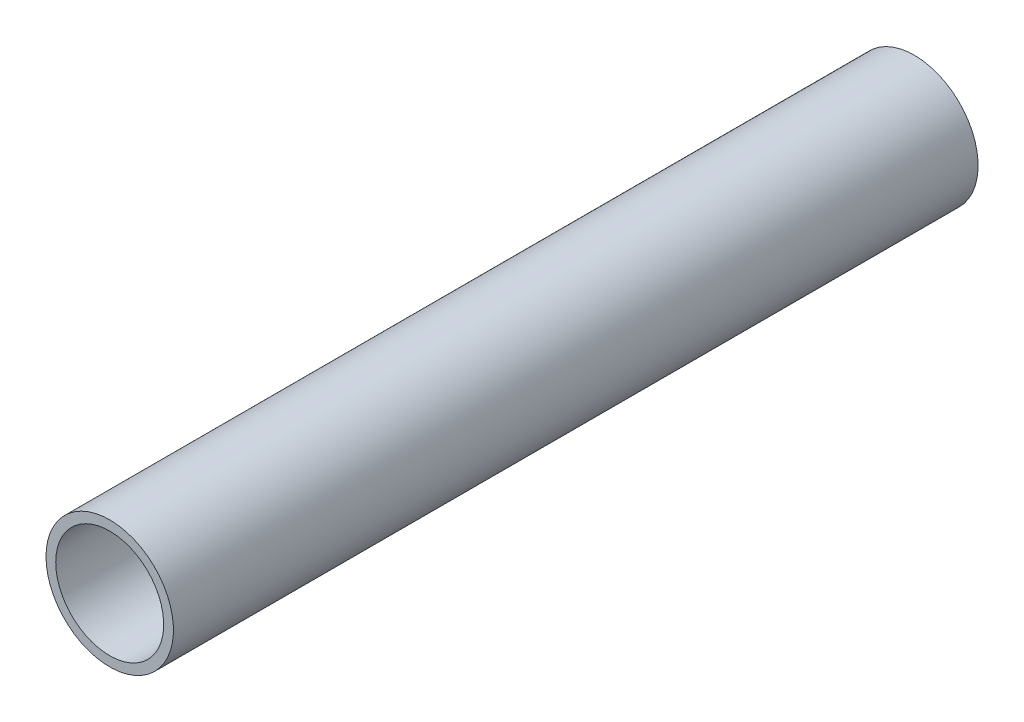
ISO-10303-21;
HEADER;
FILE_DESCRIPTION(('STEP AP214'),'2;1');
FILE_NAME('part.step','',(''),(''),'','','');
FILE_SCHEMA(('AUTOMOTIVE_DESIGN { 1 0 10303 214 1 1 1 1 }'));
ENDSEC;
DATA;
#1=APPLICATION_CONTEXT('core data for automotive mechanical design processes');
#2=APPLICATION_PROTOCOL_DEFINITION('international standard','automotive_design',2000,#1);
#3=PRODUCT_CONTEXT('',#1,'mechanical');
#4=PRODUCT('Part','Part','',(#3));
#5=PRODUCT_RELATED_PRODUCT_CATEGORY('part','',(#4));
#6=PRODUCT_DEFINITION_FORMATION('','',#4);
#7=PRODUCT_DEFINITION_CONTEXT('part definition',#1,'design');
#8=PRODUCT_DEFINITION('design','',#6,#7);
#9=PRODUCT_DEFINITION_SHAPE('','',#8);
#10=(LENGTH_UNIT() NAMED_UNIT(*) SI_UNIT(.MILLI.,.METRE.));
#11=(NAMED_UNIT(*) PLANE_ANGLE_UNIT() SI_UNIT($,.RADIAN.));
#12=(NAMED_UNIT(*) SI_UNIT($,.STERADIAN.) SOLID_ANGLE_UNIT());
#13=UNCERTAINTY_MEASURE_WITH_UNIT(LENGTH_MEASURE(1.E-05),#10,'distance_accuracy_value','');
#14=(GEOMETRIC_REPRESENTATION_CONTEXT(3) GLOBAL_UNCERTAINTY_ASSIGNED_CONTEXT((#13)) GLOBAL_UNIT_ASSIGNED_CONTEXT((#10,
#11,#12)) REPRESENTATION_CONTEXT('',''));
#15=CARTESIAN_POINT('',(0.,0.,0.));
#16=DIRECTION('',(0.,0.,1.));
#17=DIRECTION('',(1.,0.,0.));
#18=AXIS2_PLACEMENT_3D('',#15,#16,#17);
#19=CARTESIAN_POINT('',(0.,0.,304.8));
#20=DIRECTION('',(0.,0.,-1.));
#21=DIRECTION('',(-1.,0.,0.));
#22=AXIS2_PLACEMENT_3D('',#19,#20,#21);
#23=CYLINDRICAL_SURFACE('',#22,20.447);
#24=CARTESIAN_POINT('',(0.,0.,304.8));
#25=DIRECTION('',(0.,0.,1.));
#26=DIRECTION('',(1.,0.,0.));
#27=AXIS2_PLACEMENT_3D('',#24,#25,#26);
#28=CIRCLE('',#27,20.447);
#29=CARTESIAN_POINT('',(-20.447,0.,304.8));
#30=VERTEX_POINT('',#29);
#31=EDGE_CURVE('E56',#30,#30,#28,.T.);
#32=CARTESIAN_POINT('',(0.,0.,8.0772));
#33=DIRECTION('',(0.,0.,-1.));
#34=DIRECTION('',(-1.,0.,0.));
#35=AXIS2_PLACEMENT_3D('',#32,#33,#34);
#36=CIRCLE('',#35,20.447);
#37=CARTESIAN_POINT('',(-20.447,0.,8.07720000000001));
#38=VERTEX_POINT('',#37);
#39=EDGE_CURVE('E70',#38,#38,#36,.T.);
#40=CARTESIAN_POINT('',(-20.447,0.,304.8));
#41=CARTESIAN_POINT('',(-20.447,0.,301.7091375));
#42=CARTESIAN_POINT('',(-20.447,0.,298.618275));
#43=CARTESIAN_POINT('',(-20.447,0.,292.43655));
#44=CARTESIAN_POINT('',(-20.447,0.,289.3456875));
#45=CARTESIAN_POINT('',(-20.447,0.,283.1639625));
#46=CARTESIAN_POINT('',(-20.447,0.,280.0731));
#47=CARTESIAN_POINT('',(-20.447,0.,273.891375));
#48=CARTESIAN_POINT('',(-20.447,0.,270.8005125));
#49=CARTESIAN_POINT('',(-20.447,0.,264.6187875));
#50=CARTESIAN_POINT('',(-20.447,0.,261.527925));
#51=CARTESIAN_POINT('',(-20.447,0.,255.3462));
#52=CARTESIAN_POINT('',(-20.447,0.,252.2553375));
#53=CARTESIAN_POINT('',(-20.447,0.,246.0736125));
#54=CARTESIAN_POINT('',(-20.447,0.,242.98275));
#55=CARTESIAN_POINT('',(-20.447,0.,236.801025));
#56=CARTESIAN_POINT('',(-20.447,0.,233.7101625));
#57=CARTESIAN_POINT('',(-20.447,0.,227.5284375));
#58=CARTESIAN_POINT('',(-20.447,0.,224.437575));
#59=CARTESIAN_POINT('',(-20.447,0.,218.25585));
#60=CARTESIAN_POINT('',(-20.447,0.,215.1649875));
#61=CARTESIAN_POINT('',(-20.447,0.,208.9832625));
#62=CARTESIAN_POINT('',(-20.447,0.,205.8924));
#63=CARTESIAN_POINT('',(-20.447,0.,199.710675));
#64=CARTESIAN_POINT('',(-20.447,0.,196.6198125));
#65=CARTESIAN_POINT('',(-20.447,0.,190.4380875));
#66=CARTESIAN_POINT('',(-20.447,0.,187.347225));
#67=CARTESIAN_POINT('',(-20.447,0.,181.1655));
#68=CARTESIAN_POINT('',(-20.447,0.,178.0746375));
#69=CARTESIAN_POINT('',(-20.447,0.,171.8929125));
#70=CARTESIAN_POINT('',(-20.447,0.,168.80205));
#71=CARTESIAN_POINT('',(-20.447,0.,162.620325));
#72=CARTESIAN_POINT('',(-20.447,0.,159.5294625));
#73=CARTESIAN_POINT('',(-20.447,0.,153.3477375));
#74=CARTESIAN_POINT('',(-20.447,0.,150.256875));
#75=CARTESIAN_POINT('',(-20.447,0.,144.07515));
#76=CARTESIAN_POINT('',(-20.447,0.,140.9842875));
#77=CARTESIAN_POINT('',(-20.447,0.,134.8025625));
#78=CARTESIAN_POINT('',(-20.447,0.,131.7117));
#79=CARTESIAN_POINT('',(-20.447,0.,125.529975));
#80=CARTESIAN_POINT('',(-20.447,0.,122.4391125));
#81=CARTESIAN_POINT('',(-20.447,0.,116.2573875));
#82=CARTESIAN_POINT('',(-20.447,0.,113.166525));
#83=CARTESIAN_POINT('',(-20.447,0.,106.9848));
#84=CARTESIAN_POINT('',(-20.447,0.,103.8939375));
#85=CARTESIAN_POINT('',(-20.447,0.,97.7122125));
#86=CARTESIAN_POINT('',(-20.447,0.,94.62135));
#87=CARTESIAN_POINT('',(-20.447,0.,88.439625));
#88=CARTESIAN_POINT('',(-20.447,0.,85.3487625));
#89=CARTESIAN_POINT('',(-20.447,0.,79.1670375));
#90=CARTESIAN_POINT('',(-20.447,0.,76.0761749999999));
#91=CARTESIAN_POINT('',(-20.447,0.,69.8944499999999));
#92=CARTESIAN_POINT('',(-20.447,0.,66.8035875));
#93=CARTESIAN_POINT('',(-20.447,0.,60.6218625));
#94=CARTESIAN_POINT('',(-20.447,0.,57.531));
#95=CARTESIAN_POINT('',(-20.447,0.,51.349275));
#96=CARTESIAN_POINT('',(-20.447,0.,48.2584125));
#97=CARTESIAN_POINT('',(-20.447,0.,42.0766875));
#98=CARTESIAN_POINT('',(-20.447,0.,38.985825));
#99=CARTESIAN_POINT('',(-20.447,0.,32.8041));
#100=CARTESIAN_POINT('',(-20.447,0.,29.7132375));
#101=CARTESIAN_POINT('',(-20.447,0.,23.5315125));
#102=CARTESIAN_POINT('',(-20.447,0.,20.44065));
#103=CARTESIAN_POINT('',(-20.447,0.,14.258925));
#104=CARTESIAN_POINT('',(-20.447,0.,11.1680625));
#105=CARTESIAN_POINT('',(-20.447,0.,8.07720000000001));
#106=B_SPLINE_CURVE_WITH_KNOTS('',3,(#40,#41,#42,#43,#44,#45,#46,#47,#48,#49,#50,#51,#52,#53,
#54,#55,#56,#57,#58,#59,#60,#61,#62,#63,#64,#65,#66,#67,#68,#69,#70,#71,#72,#73,#74,#75,#76,#77,
#78,#79,#80,#81,#82,#83,#84,#85,#86,#87,#88,#89,#90,#91,#92,#93,#94,#95,#96,#97,#98,#99,#100,
#101,#102,#103,#104,#105),.UNSPECIFIED.,.F.,.F.,(4,2,2,2,2,2,2,2,2,2,2,2,2,2,2,2,2,2,2,2,2,2,2,
2,2,2,2,2,2,2,2,2,4),(0.,9.27258750000004,18.545175,27.8177625,37.0903500000001,46.3629375,
55.635525,64.9081125,74.1807,83.4532875,92.725875,101.9984625,111.27105,120.5436375,129.816225,
139.0888125,148.3614,157.6339875,166.906575,176.1791625,185.45175,194.7243375,203.996925,
213.2695125,222.5421,231.8146875,241.087275,250.3598625,259.63245,268.9050375,278.177625,
287.4502125,296.7228),.UNSPECIFIED.);
#107=EDGE_CURVE('BSEAM43',#30,#38,#106,.T.);
#108=ORIENTED_EDGE('',*,*,#31,.T.);
#109=ORIENTED_EDGE('',*,*,#39,.T.);
#110=ORIENTED_EDGE('',*,*,#107,.T.);
#111=ORIENTED_EDGE('',*,*,#107,.F.);
#112=EDGE_LOOP('',(#108,#110,#109,#111));
#113=FACE_BOUND('',#112,.T.);
#114=ADVANCED_FACE('F43',(#113),#23,.F.);
#115=CARTESIAN_POINT('',(0.,0.,304.8));
#116=DIRECTION('',(0.,0.,1.));
#117=DIRECTION('',(1.,0.,0.));
#118=AXIS2_PLACEMENT_3D('',#115,#116,#117);
#119=PLANE('',#118);
#120=CARTESIAN_POINT('',(0.,0.,304.8));
#121=DIRECTION('',(0.,0.,1.));
#122=DIRECTION('',(1.,0.,0.));
#123=AXIS2_PLACEMENT_3D('',#120,#121,#122);
#124=CIRCLE('',#123,24.13);
#125=CARTESIAN_POINT('',(-24.13,0.,304.8));
#126=VERTEX_POINT('',#125);
#127=EDGE_CURVE('E10',#126,#126,#124,.T.);
#128=ORIENTED_EDGE('',*,*,#127,.T.);
#129=EDGE_LOOP('',(#128));
#130=FACE_BOUND('',#129,.T.);
#131=ORIENTED_EDGE('',*,*,#31,.F.);
#132=EDGE_LOOP('',(#131));
#133=FACE_BOUND('',#132,.T.);
#134=ADVANCED_FACE('F103',(#130,#133),#119,.T.);
#135=CARTESIAN_POINT('',(0.,0.,0.));
#136=DIRECTION('',(0.,0.,1.));
#137=DIRECTION('',(1.,0.,0.));
#138=AXIS2_PLACEMENT_3D('',#135,#136,#137);
#139=PLANE('',#138);
#140=CARTESIAN_POINT('',(0.,0.,0.));
#141=DIRECTION('',(0.,0.,1.));
#142=DIRECTION('',(1.,0.,0.));
#143=AXIS2_PLACEMENT_3D('',#140,#141,#142);
#144=CIRCLE('',#143,24.13);
#145=CARTESIAN_POINT('',(-24.13,0.,0.));
#146=VERTEX_POINT('',#145);
#147=EDGE_CURVE('E47',#146,#146,#144,.T.);
#148=ORIENTED_EDGE('',*,*,#147,.F.);
#149=EDGE_LOOP('',(#148));
#150=FACE_BOUND('',#149,.T.);
#151=CARTESIAN_POINT('',(0.,0.,0.));
#152=DIRECTION('',(0.,0.,1.));
#153=DIRECTION('',(1.,0.,0.));
#154=AXIS2_PLACEMENT_3D('',#151,#152,#153);
#155=CIRCLE('',#154,20.447);
#156=CARTESIAN_POINT('',(-20.447,0.,0.));
#157=VERTEX_POINT('',#156);
#158=EDGE_CURVE('E58',#157,#157,#155,.T.);
#159=ORIENTED_EDGE('',*,*,#158,.T.);
#160=EDGE_LOOP('',(#159));
#161=FACE_BOUND('',#160,.T.);
#162=ADVANCED_FACE('F111',(#150,#161),#139,.F.);
#163=CARTESIAN_POINT('',(0.,0.,304.8));
#164=DIRECTION('',(0.,0.,-1.));
#165=DIRECTION('',(-1.,0.,0.));
#166=AXIS2_PLACEMENT_3D('',#163,#164,#165);
#167=CYLINDRICAL_SURFACE('',#166,24.13);
#168=CARTESIAN_POINT('',(-24.13,0.,304.8));
#169=CARTESIAN_POINT('',(-24.13,0.,301.625));
#170=CARTESIAN_POINT('',(-24.13,0.,298.45));
#171=CARTESIAN_POINT('',(-24.13,0.,292.1));
#172=CARTESIAN_POINT('',(-24.13,0.,288.925));
#173=CARTESIAN_POINT('',(-24.13,0.,282.575));
#174=CARTESIAN_POINT('',(-24.13,0.,279.4));
#175=CARTESIAN_POINT('',(-24.13,0.,273.05));
#176=CARTESIAN_POINT('',(-24.13,0.,269.875));
#177=CARTESIAN_POINT('',(-24.13,0.,263.525));
#178=CARTESIAN_POINT('',(-24.13,0.,260.35));
#179=CARTESIAN_POINT('',(-24.13,0.,254.));
#180=CARTESIAN_POINT('',(-24.13,0.,250.825));
#181=CARTESIAN_POINT('',(-24.13,0.,244.475));
#182=CARTESIAN_POINT('',(-24.13,0.,241.3));
#183=CARTESIAN_POINT('',(-24.13,0.,234.95));
#184=CARTESIAN_POINT('',(-24.13,0.,231.775));
#185=CARTESIAN_POINT('',(-24.13,0.,225.425));
#186=CARTESIAN_POINT('',(-24.13,0.,222.25));
#187=CARTESIAN_POINT('',(-24.13,0.,215.9));
#188=CARTESIAN_POINT('',(-24.13,0.,212.725));
#189=CARTESIAN_POINT('',(-24.13,0.,206.375));
#190=CARTESIAN_POINT('',(-24.13,0.,203.2));
#191=CARTESIAN_POINT('',(-24.13,0.,196.85));
#192=CARTESIAN_POINT('',(-24.13,0.,193.675));
#193=CARTESIAN_POINT('',(-24.13,0.,187.325));
#194=CARTESIAN_POINT('',(-24.13,0.,184.15));
#195=CARTESIAN_POINT('',(-24.13,0.,177.8));
#196=CARTESIAN_POINT('',(-24.13,0.,174.625));
#197=CARTESIAN_POINT('',(-24.13,0.,168.275));
#198=CARTESIAN_POINT('',(-24.13,0.,165.1));
#199=CARTESIAN_POINT('',(-24.13,0.,158.75));
#200=CARTESIAN_POINT('',(-24.13,0.,155.575));
#201=CARTESIAN_POINT('',(-24.13,0.,149.225));
#202=CARTESIAN_POINT('',(-24.13,0.,146.05));
#203=CARTESIAN_POINT('',(-24.13,0.,139.7));
#204=CARTESIAN_POINT('',(-24.13,0.,136.525));
#205=CARTESIAN_POINT('',(-24.13,0.,130.175));
#206=CARTESIAN_POINT('',(-24.13,0.,127.));
#207=CARTESIAN_POINT('',(-24.13,0.,120.65));
#208=CARTESIAN_POINT('',(-24.13,0.,117.475));
#209=CARTESIAN_POINT('',(-24.13,0.,111.125));
#210=CARTESIAN_POINT('',(-24.13,0.,107.95));
#211=CARTESIAN_POINT('',(-24.13,0.,101.6));
#212=CARTESIAN_POINT('',(-24.13,0.,98.425));
#213=CARTESIAN_POINT('',(-24.13,0.,92.075));
#214=CARTESIAN_POINT('',(-24.13,0.,88.9));
#215=CARTESIAN_POINT('',(-24.13,0.,82.55));
#216=CARTESIAN_POINT('',(-24.13,0.,79.375));
#217=CARTESIAN_POINT('',(-24.13,0.,73.025));
#218=CARTESIAN_POINT('',(-24.13,0.,69.85));
#219=CARTESIAN_POINT('',(-24.13,0.,63.5));
#220=CARTESIAN_POINT('',(-24.13,0.,60.325));
#221=CARTESIAN_POINT('',(-24.13,0.,53.975));
#222=CARTESIAN_POINT('',(-24.13,0.,50.8));
#223=CARTESIAN_POINT('',(-24.13,0.,44.45));
#224=CARTESIAN_POINT('',(-24.13,0.,41.275));
#225=CARTESIAN_POINT('',(-24.13,0.,34.925));
#226=CARTESIAN_POINT('',(-24.13,0.,31.75));
#227=CARTESIAN_POINT('',(-24.13,0.,25.4));
#228=CARTESIAN_POINT('',(-24.13,0.,22.225));
#229=CARTESIAN_POINT('',(-24.13,0.,15.875));
#230=CARTESIAN_POINT('',(-24.13,0.,12.7));
#231=CARTESIAN_POINT('',(-24.13,0.,6.35));
#232=CARTESIAN_POINT('',(-24.13,0.,3.175));
#233=CARTESIAN_POINT('',(-24.13,0.,0.));
#234=B_SPLINE_CURVE_WITH_KNOTS('',3,(#168,#169,#170,#171,#172,#173,#174,#175,#176,#177,#178,
#179,#180,#181,#182,#183,#184,#185,#186,#187,#188,#189,#190,#191,#192,#193,#194,#195,#196,#197,
#198,#199,#200,#201,#202,#203,#204,#205,#206,#207,#208,#209,#210,#211,#212,#213,#214,#215,#216,
#217,#218,#219,#220,#221,#222,#223,#224,#225,#226,#227,#228,#229,#230,#231,#232,#233),
.UNSPECIFIED.,.F.,.F.,(4,2,2,2,2,2,2,2,2,2,2,2,2,2,2,2,2,2,2,2,2,2,2,2,2,2,2,2,2,2,2,2,4),(0.,
9.52500000000001,19.05,28.575,38.1,47.625,57.15,66.675,76.2,85.7250000000001,95.2500000000001,
104.775,114.3,123.825,133.35,142.875,152.4,161.925,171.45,180.975,190.5,200.025,209.55,219.075,
228.6,238.125,247.65,257.175,266.7,276.225,285.75,295.275,304.8),.UNSPECIFIED.);
#235=EDGE_CURVE('BSEAM45',#126,#146,#234,.T.);
#236=ORIENTED_EDGE('',*,*,#127,.F.);
#237=ORIENTED_EDGE('',*,*,#147,.T.);
#238=ORIENTED_EDGE('',*,*,#235,.T.);
#239=ORIENTED_EDGE('',*,*,#235,.F.);
#240=EDGE_LOOP('',(#236,#238,#237,#239));
#241=FACE_BOUND('',#240,.T.);
#242=ADVANCED_FACE('F45',(#241),#167,.T.);
#243=CARTESIAN_POINT('',(0.,0.,6.35));
#244=DIRECTION('',(0.,0.,-1.));
#245=DIRECTION('',(-1.,0.,0.));
#246=AXIS2_PLACEMENT_3D('',#243,#244,#245);
#247=CIRCLE('',#246,20.447);
#248=CARTESIAN_POINT('',(-20.447,0.,6.34999999999997));
#249=VERTEX_POINT('',#248);
#250=EDGE_CURVE('E74',#249,#249,#247,.T.);
#251=CARTESIAN_POINT('',(-20.447,0.,6.34999999999997));
#252=CARTESIAN_POINT('',(-20.447,0.,6.28385416666664));
#253=CARTESIAN_POINT('',(-20.447,0.,6.21770833333331));
#254=CARTESIAN_POINT('',(-20.447,0.,6.08541666666664));
#255=CARTESIAN_POINT('',(-20.447,0.,6.01927083333329));
#256=CARTESIAN_POINT('',(-20.447,0.,5.88697916666662));
#257=CARTESIAN_POINT('',(-20.447,0.,5.82083333333329));
#258=CARTESIAN_POINT('',(-20.447,0.,5.68854166666664));
#259=CARTESIAN_POINT('',(-20.447,0.,5.62239583333331));
#260=CARTESIAN_POINT('',(-20.447,0.,5.49010416666664));
#261=CARTESIAN_POINT('',(-20.447,0.,5.42395833333329));
#262=CARTESIAN_POINT('',(-20.447,0.,5.29166666666662));
#263=CARTESIAN_POINT('',(-20.447,0.,5.22552083333329));
#264=CARTESIAN_POINT('',(-20.447,0.,5.09322916666664));
#265=CARTESIAN_POINT('',(-20.447,0.,5.02708333333331));
#266=CARTESIAN_POINT('',(-20.447,0.,4.89479166666666));
#267=CARTESIAN_POINT('',(-20.447,0.,4.82864583333333));
#268=CARTESIAN_POINT('',(-20.447,0.,4.69635416666666));
#269=CARTESIAN_POINT('',(-20.447,0.,4.63020833333331));
#270=CARTESIAN_POINT('',(-20.447,0.,4.49791666666664));
#271=CARTESIAN_POINT('',(-20.447,0.,4.43177083333331));
#272=CARTESIAN_POINT('',(-20.447,0.,4.29947916666666));
#273=CARTESIAN_POINT('',(-20.447,0.,4.23333333333333));
#274=CARTESIAN_POINT('',(-20.447,0.,4.10104166666666));
#275=CARTESIAN_POINT('',(-20.447,0.,4.03489583333331));
#276=CARTESIAN_POINT('',(-20.447,0.,3.90260416666664));
#277=CARTESIAN_POINT('',(-20.447,0.,3.83645833333331));
#278=CARTESIAN_POINT('',(-20.447,0.,3.70416666666666));
#279=CARTESIAN_POINT('',(-20.447,0.,3.63802083333333));
#280=CARTESIAN_POINT('',(-20.447,0.,3.50572916666666));
#281=CARTESIAN_POINT('',(-20.447,0.,3.43958333333331));
#282=CARTESIAN_POINT('',(-20.447,0.,3.30729166666664));
#283=CARTESIAN_POINT('',(-20.447,0.,3.24114583333331));
#284=CARTESIAN_POINT('',(-20.447,0.,3.10885416666666));
#285=CARTESIAN_POINT('',(-20.447,0.,3.04270833333333));
#286=CARTESIAN_POINT('',(-20.447,0.,2.91041666666666));
#287=CARTESIAN_POINT('',(-20.447,0.,2.84427083333331));
#288=CARTESIAN_POINT('',(-20.447,0.,2.71197916666664));
#289=CARTESIAN_POINT('',(-20.447,0.,2.64583333333331));
#290=CARTESIAN_POINT('',(-20.447,0.,2.51354166666666));
#291=CARTESIAN_POINT('',(-20.447,0.,2.44739583333333));
#292=CARTESIAN_POINT('',(-20.447,0.,2.31510416666666));
#293=CARTESIAN_POINT('',(-20.447,0.,2.24895833333331));
#294=CARTESIAN_POINT('',(-20.447,0.,2.11666666666664));
#295=CARTESIAN_POINT('',(-20.447,0.,2.05052083333331));
#296=CARTESIAN_POINT('',(-20.447,0.,1.91822916666666));
#297=CARTESIAN_POINT('',(-20.447,0.,1.85208333333333));
#298=CARTESIAN_POINT('',(-20.447,0.,1.71979166666666));
#299=CARTESIAN_POINT('',(-20.447,0.,1.65364583333331));
#300=CARTESIAN_POINT('',(-20.447,0.,1.52135416666664));
#301=CARTESIAN_POINT('',(-20.447,0.,1.45520833333331));
#302=CARTESIAN_POINT('',(-20.447,0.,1.32291666666666));
#303=CARTESIAN_POINT('',(-20.447,0.,1.25677083333333));
#304=CARTESIAN_POINT('',(-20.447,0.,1.12447916666667));
#305=CARTESIAN_POINT('',(-20.447,0.,1.05833333333335));
#306=CARTESIAN_POINT('',(-20.447,0.,0.926041666666673));
#307=CARTESIAN_POINT('',(-20.447,0.,0.859895833333328));
#308=CARTESIAN_POINT('',(-20.447,0.,0.727604166666655));
#309=CARTESIAN_POINT('',(-20.447,0.,0.661458333333328));
#310=CARTESIAN_POINT('',(-20.447,0.,0.529166666666673));
#311=CARTESIAN_POINT('',(-20.447,0.,0.463020833333346));
#312=CARTESIAN_POINT('',(-20.447,0.,0.330729166666673));
#313=CARTESIAN_POINT('',(-20.447,0.,0.264583333333327));
#314=CARTESIAN_POINT('',(-20.447,0.,0.132291666666654));
#315=CARTESIAN_POINT('',(-20.447,0.,0.0661458333333272));
#316=CARTESIAN_POINT('',(-20.447,0.,0.));
#317=B_SPLINE_CURVE_WITH_KNOTS('',3,(#251,#252,#253,#254,#255,#256,#257,#258,#259,#260,#261,
#262,#263,#264,#265,#266,#267,#268,#269,#270,#271,#272,#273,#274,#275,#276,#277,#278,#279,#280,
#281,#282,#283,#284,#285,#286,#287,#288,#289,#290,#291,#292,#293,#294,#295,#296,#297,#298,#299,
#300,#301,#302,#303,#304,#305,#306,#307,#308,#309,#310,#311,#312,#313,#314,#315,#316),
.UNSPECIFIED.,.F.,.F.,(4,2,2,2,2,2,2,2,2,2,2,2,2,2,2,2,2,2,2,2,2,2,2,2,2,2,2,2,2,2,2,2,4),(0.,
0.198437499999982,0.396875000000019,0.5953125,0.793749999999982,0.992187500000019,1.190625,
1.38906249999998,1.58749999999996,1.7859375,1.98437499999998,2.18281249999996,2.38125,
2.57968749999998,2.77812499999996,2.9765625,3.17499999999998,3.37343749999997,3.571875,
3.77031249999998,3.96874999999997,4.1671875,4.36562499999998,4.56406249999997,4.7625,
4.96093749999998,5.15937499999997,5.35781249999995,5.55624999999998,5.75468749999997,
5.95312499999995,6.15156249999998,6.34999999999997),.UNSPECIFIED.);
#318=EDGE_CURVE('BSEAM93',#249,#157,#317,.T.);
#319=ORIENTED_EDGE('',*,*,#250,.F.);
#320=ORIENTED_EDGE('',*,*,#158,.F.);
#321=ORIENTED_EDGE('',*,*,#318,.T.);
#322=ORIENTED_EDGE('',*,*,#318,.F.);
#323=EDGE_LOOP('',(#319,#321,#320,#322));
#324=FACE_BOUND('',#323,.T.);
#325=ADVANCED_FACE('F93',(#324),#23,.F.);
#326=CARTESIAN_POINT('',(0.,0.,8.0772));
#327=DIRECTION('',(0.,0.,-1.));
#328=DIRECTION('',(-1.,0.,0.));
#329=AXIS2_PLACEMENT_3D('',#326,#327,#328);
#330=CYLINDRICAL_SURFACE('',#329,21.9075);
#331=CARTESIAN_POINT('',(0.,0.,8.0772));
#332=DIRECTION('',(0.,0.,-1.));
#333=DIRECTION('',(-1.,0.,0.));
#334=AXIS2_PLACEMENT_3D('',#331,#332,#333);
#335=CIRCLE('',#334,21.9075);
#336=CARTESIAN_POINT('',(-21.9075,0.,8.0772));
#337=VERTEX_POINT('',#336);
#338=EDGE_CURVE('E62',#337,#337,#335,.T.);
#339=ORIENTED_EDGE('',*,*,#338,.F.);
#340=EDGE_LOOP('',(#339));
#341=FACE_BOUND('',#340,.T.);
#342=CARTESIAN_POINT('',(0.,0.,6.35));
#343=DIRECTION('',(0.,0.,-1.));
#344=DIRECTION('',(-1.,0.,0.));
#345=AXIS2_PLACEMENT_3D('',#342,#343,#344);
#346=CIRCLE('',#345,21.9075);
#347=CARTESIAN_POINT('',(-21.9075,0.,6.35));
#348=VERTEX_POINT('',#347);
#349=EDGE_CURVE('E66',#348,#348,#346,.T.);
#350=ORIENTED_EDGE('',*,*,#349,.T.);
#351=EDGE_LOOP('',(#350));
#352=FACE_BOUND('',#351,.T.);
#353=ADVANCED_FACE('F87',(#341,#352),#330,.F.);
#354=CARTESIAN_POINT('',(0.,0.,8.0772));
#355=DIRECTION('',(0.,0.,-1.));
#356=DIRECTION('',(-1.,0.,0.));
#357=AXIS2_PLACEMENT_3D('',#354,#355,#356);
#358=PLANE('',#357);
#359=ORIENTED_EDGE('',*,*,#39,.F.);
#360=EDGE_LOOP('',(#359));
#361=FACE_BOUND('',#360,.T.);
#362=ORIENTED_EDGE('',*,*,#338,.T.);
#363=EDGE_LOOP('',(#362));
#364=FACE_BOUND('',#363,.T.);
#365=ADVANCED_FACE('F83',(#361,#364),#358,.T.);
#366=CARTESIAN_POINT('',(0.,0.,6.35));
#367=DIRECTION('',(0.,0.,-1.));
#368=DIRECTION('',(-1.,0.,0.));
#369=AXIS2_PLACEMENT_3D('',#366,#367,#368);
#370=PLANE('',#369);
#371=ORIENTED_EDGE('',*,*,#250,.T.);
#372=EDGE_LOOP('',(#371));
#373=FACE_BOUND('',#372,.T.);
#374=ORIENTED_EDGE('',*,*,#349,.F.);
#375=EDGE_LOOP('',(#374));
#376=FACE_BOUND('',#375,.T.);
#377=ADVANCED_FACE('F86',(#373,#376),#370,.F.);
#378=CLOSED_SHELL('',(#114,#134,#162,#242,#325,#353,#365,#377));
#379=MANIFOLD_SOLID_BREP('B2',#378);
#380=ADVANCED_BREP_SHAPE_REPRESENTATION('',(#18,#379),#14);
#381=SHAPE_DEFINITION_REPRESENTATION(#9,#380);
ENDSEC;
END-ISO-10303-21;
